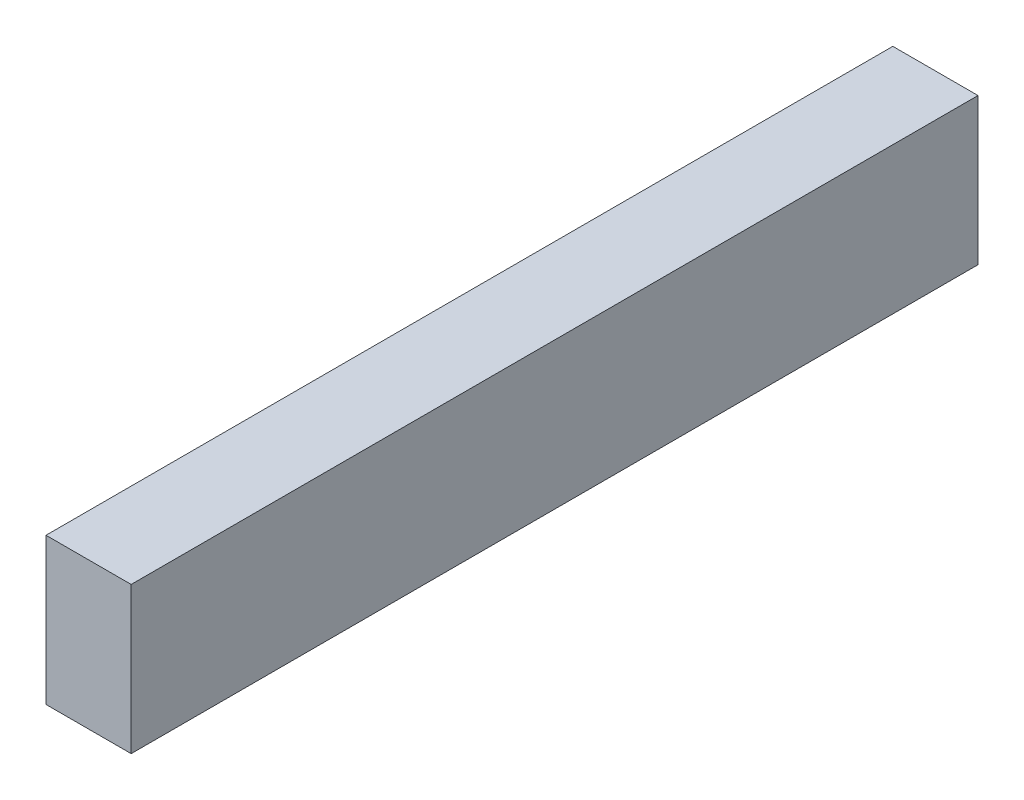
ISO-10303-21;
HEADER;
FILE_DESCRIPTION(('STEP AP214'),'2;1');
FILE_NAME('part.step','',(''),(''),'','','');
FILE_SCHEMA(('AUTOMOTIVE_DESIGN { 1 0 10303 214 1 1 1 1 }'));
ENDSEC;
DATA;
#1=APPLICATION_CONTEXT('core data for automotive mechanical design processes');
#2=APPLICATION_PROTOCOL_DEFINITION('international standard','automotive_design',2000,#1);
#3=PRODUCT_CONTEXT('',#1,'mechanical');
#4=PRODUCT('Part','Part','',(#3));
#5=PRODUCT_RELATED_PRODUCT_CATEGORY('part','',(#4));
#6=PRODUCT_DEFINITION_FORMATION('','',#4);
#7=PRODUCT_DEFINITION_CONTEXT('part definition',#1,'design');
#8=PRODUCT_DEFINITION('design','',#6,#7);
#9=PRODUCT_DEFINITION_SHAPE('','',#8);
#10=(LENGTH_UNIT() NAMED_UNIT(*) SI_UNIT(.MILLI.,.METRE.));
#11=(NAMED_UNIT(*) PLANE_ANGLE_UNIT() SI_UNIT($,.RADIAN.));
#12=(NAMED_UNIT(*) SI_UNIT($,.STERADIAN.) SOLID_ANGLE_UNIT());
#13=UNCERTAINTY_MEASURE_WITH_UNIT(LENGTH_MEASURE(1.E-05),#10,'distance_accuracy_value','');
#14=(GEOMETRIC_REPRESENTATION_CONTEXT(3) GLOBAL_UNCERTAINTY_ASSIGNED_CONTEXT((#13)) GLOBAL_UNIT_ASSIGNED_CONTEXT((#10,
#11,#12)) REPRESENTATION_CONTEXT('',''));
#15=CARTESIAN_POINT('',(0.,0.,0.));
#16=DIRECTION('',(0.,0.,1.));
#17=DIRECTION('',(1.,0.,0.));
#18=AXIS2_PLACEMENT_3D('',#15,#16,#17);
#19=CARTESIAN_POINT('',(0.,2.286,13.208));
#20=DIRECTION('',(-1.,0.,0.));
#21=DIRECTION('',(0.,0.,1.));
#22=AXIS2_PLACEMENT_3D('',#19,#20,#21);
#23=PLANE('',#22);
#24=DIRECTION('',(0.,0.,-1.));
#25=VECTOR('',#24,1.);
#26=CARTESIAN_POINT('',(0.,0.,13.208));
#27=LINE('',#26,#25);
#28=CARTESIAN_POINT('',(0.,0.,13.208));
#29=VERTEX_POINT('',#28);
#30=CARTESIAN_POINT('',(0.,0.,0.));
#31=VERTEX_POINT('',#30);
#32=EDGE_CURVE('E121',#29,#31,#27,.T.);
#33=ORIENTED_EDGE('',*,*,#32,.T.);
#34=DIRECTION('',(0.,-1.,0.));
#35=VECTOR('',#34,1.);
#36=CARTESIAN_POINT('',(0.,2.286,0.));
#37=LINE('',#36,#35);
#38=CARTESIAN_POINT('',(0.,2.286,0.));
#39=VERTEX_POINT('',#38);
#40=EDGE_CURVE('E11',#39,#31,#37,.T.);
#41=ORIENTED_EDGE('',*,*,#40,.F.);
#42=DIRECTION('',(0.,0.,-1.));
#43=VECTOR('',#42,1.);
#44=CARTESIAN_POINT('',(0.,2.286,13.208));
#45=LINE('',#44,#43);
#46=CARTESIAN_POINT('',(0.,2.286,13.208));
#47=VERTEX_POINT('',#46);
#48=EDGE_CURVE('E103',#47,#39,#45,.T.);
#49=ORIENTED_EDGE('',*,*,#48,.F.);
#50=DIRECTION('',(0.,-1.,0.));
#51=VECTOR('',#50,1.);
#52=CARTESIAN_POINT('',(0.,2.286,13.208));
#53=LINE('',#52,#51);
#54=EDGE_CURVE('E117',#47,#29,#53,.T.);
#55=ORIENTED_EDGE('',*,*,#54,.T.);
#56=EDGE_LOOP('',(#33,#41,#49,#55));
#57=FACE_BOUND('',#56,.T.);
#58=ADVANCED_FACE('F43',(#57),#23,.F.);
#59=CARTESIAN_POINT('',(-1.32842,2.286,0.));
#60=DIRECTION('',(0.,0.,1.));
#61=DIRECTION('',(1.,0.,0.));
#62=AXIS2_PLACEMENT_3D('',#59,#60,#61);
#63=PLANE('',#62);
#64=DIRECTION('',(-1.,0.,0.));
#65=VECTOR('',#64,1.);
#66=CARTESIAN_POINT('',(-1.32842,0.,0.));
#67=LINE('',#66,#65);
#68=CARTESIAN_POINT('',(-1.32842,0.,0.));
#69=VERTEX_POINT('',#68);
#70=EDGE_CURVE('E108',#31,#69,#67,.T.);
#71=ORIENTED_EDGE('',*,*,#70,.T.);
#72=DIRECTION('',(0.,-1.,0.));
#73=VECTOR('',#72,1.);
#74=CARTESIAN_POINT('',(-1.32842,2.286,0.));
#75=LINE('',#74,#73);
#76=CARTESIAN_POINT('',(-1.32842,2.286,0.));
#77=VERTEX_POINT('',#76);
#78=EDGE_CURVE('E52',#77,#69,#75,.T.);
#79=ORIENTED_EDGE('',*,*,#78,.F.);
#80=DIRECTION('',(-1.,0.,0.));
#81=VECTOR('',#80,1.);
#82=CARTESIAN_POINT('',(-1.32842,2.286,0.));
#83=LINE('',#82,#81);
#84=EDGE_CURVE('E97',#39,#77,#83,.T.);
#85=ORIENTED_EDGE('',*,*,#84,.F.);
#86=ORIENTED_EDGE('',*,*,#40,.T.);
#87=EDGE_LOOP('',(#71,#79,#85,#86));
#88=FACE_BOUND('',#87,.T.);
#89=ADVANCED_FACE('F107',(#88),#63,.F.);
#90=CARTESIAN_POINT('',(-1.32842,2.286,13.208));
#91=DIRECTION('',(1.,0.,0.));
#92=DIRECTION('',(0.,0.,-1.));
#93=AXIS2_PLACEMENT_3D('',#90,#91,#92);
#94=PLANE('',#93);
#95=DIRECTION('',(0.,0.,1.));
#96=VECTOR('',#95,1.);
#97=CARTESIAN_POINT('',(-1.32842,0.,13.208));
#98=LINE('',#97,#96);
#99=CARTESIAN_POINT('',(-1.32842,0.,13.208));
#100=VERTEX_POINT('',#99);
#101=EDGE_CURVE('E83',#69,#100,#98,.T.);
#102=ORIENTED_EDGE('',*,*,#101,.T.);
#103=DIRECTION('',(0.,-1.,0.));
#104=VECTOR('',#103,1.);
#105=CARTESIAN_POINT('',(-1.32842,2.286,13.208));
#106=LINE('',#105,#104);
#107=CARTESIAN_POINT('',(-1.32842,2.286,13.208));
#108=VERTEX_POINT('',#107);
#109=EDGE_CURVE('E110',#108,#100,#106,.T.);
#110=ORIENTED_EDGE('',*,*,#109,.F.);
#111=DIRECTION('',(0.,0.,1.));
#112=VECTOR('',#111,1.);
#113=CARTESIAN_POINT('',(-1.32842,2.286,13.208));
#114=LINE('',#113,#112);
#115=EDGE_CURVE('E101',#77,#108,#114,.T.);
#116=ORIENTED_EDGE('',*,*,#115,.F.);
#117=ORIENTED_EDGE('',*,*,#78,.T.);
#118=EDGE_LOOP('',(#102,#110,#116,#117));
#119=FACE_BOUND('',#118,.T.);
#120=ADVANCED_FACE('F111',(#119),#94,.F.);
#121=CARTESIAN_POINT('',(0.,2.286,13.208));
#122=DIRECTION('',(0.,0.,-1.));
#123=DIRECTION('',(-1.,0.,0.));
#124=AXIS2_PLACEMENT_3D('',#121,#122,#123);
#125=PLANE('',#124);
#126=DIRECTION('',(1.,0.,0.));
#127=VECTOR('',#126,1.);
#128=CARTESIAN_POINT('',(0.,0.,13.208));
#129=LINE('',#128,#127);
#130=EDGE_CURVE('E90',#100,#29,#129,.T.);
#131=ORIENTED_EDGE('',*,*,#130,.T.);
#132=ORIENTED_EDGE('',*,*,#54,.F.);
#133=DIRECTION('',(1.,0.,0.));
#134=VECTOR('',#133,1.);
#135=CARTESIAN_POINT('',(0.,2.286,13.208));
#136=LINE('',#135,#134);
#137=EDGE_CURVE('E62',#108,#47,#136,.T.);
#138=ORIENTED_EDGE('',*,*,#137,.F.);
#139=ORIENTED_EDGE('',*,*,#109,.T.);
#140=EDGE_LOOP('',(#131,#132,#138,#139));
#141=FACE_BOUND('',#140,.T.);
#142=ADVANCED_FACE('F132',(#141),#125,.F.);
#143=CARTESIAN_POINT('',(0.,2.286,0.));
#144=DIRECTION('',(0.,-1.,0.));
#145=DIRECTION('',(0.,0.,-1.));
#146=AXIS2_PLACEMENT_3D('',#143,#144,#145);
#147=PLANE('',#146);
#148=ORIENTED_EDGE('',*,*,#48,.T.);
#149=ORIENTED_EDGE('',*,*,#84,.T.);
#150=ORIENTED_EDGE('',*,*,#115,.T.);
#151=ORIENTED_EDGE('',*,*,#137,.T.);
#152=EDGE_LOOP('',(#148,#149,#150,#151));
#153=FACE_BOUND('',#152,.T.);
#154=ADVANCED_FACE('F99',(#153),#147,.F.);
#155=CARTESIAN_POINT('',(0.,0.,0.));
#156=DIRECTION('',(0.,-1.,0.));
#157=DIRECTION('',(0.,0.,-1.));
#158=AXIS2_PLACEMENT_3D('',#155,#156,#157);
#159=PLANE('',#158);
#160=ORIENTED_EDGE('',*,*,#32,.F.);
#161=ORIENTED_EDGE('',*,*,#130,.F.);
#162=ORIENTED_EDGE('',*,*,#101,.F.);
#163=ORIENTED_EDGE('',*,*,#70,.F.);
#164=EDGE_LOOP('',(#160,#161,#162,#163));
#165=FACE_BOUND('',#164,.T.);
#166=ADVANCED_FACE('F135',(#165),#159,.T.);
#167=CLOSED_SHELL('',(#58,#89,#120,#142,#154,#166));
#168=MANIFOLD_SOLID_BREP('B2',#167);
#169=ADVANCED_BREP_SHAPE_REPRESENTATION('',(#18,#168),#14);
#170=SHAPE_DEFINITION_REPRESENTATION(#9,#169);
ENDSEC;
END-ISO-10303-21;
